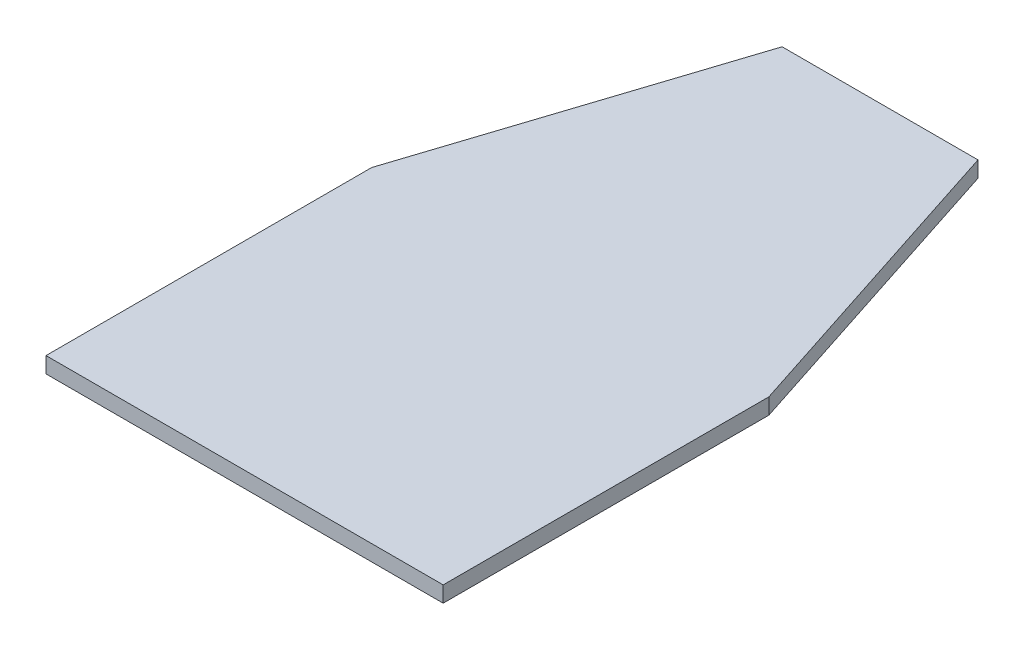
ISO-10303-21;
HEADER;
FILE_DESCRIPTION(('STEP AP214'),'2;1');
FILE_NAME('part.step','',(''),(''),'','','');
FILE_SCHEMA(('AUTOMOTIVE_DESIGN { 1 0 10303 214 1 1 1 1 }'));
ENDSEC;
DATA;
#1=APPLICATION_CONTEXT('core data for automotive mechanical design processes');
#2=APPLICATION_PROTOCOL_DEFINITION('international standard','automotive_design',2000,#1);
#3=PRODUCT_CONTEXT('',#1,'mechanical');
#4=PRODUCT('Part','Part','',(#3));
#5=PRODUCT_RELATED_PRODUCT_CATEGORY('part','',(#4));
#6=PRODUCT_DEFINITION_FORMATION('','',#4);
#7=PRODUCT_DEFINITION_CONTEXT('part definition',#1,'design');
#8=PRODUCT_DEFINITION('design','',#6,#7);
#9=PRODUCT_DEFINITION_SHAPE('','',#8);
#10=(LENGTH_UNIT() NAMED_UNIT(*) SI_UNIT(.MILLI.,.METRE.));
#11=(NAMED_UNIT(*) PLANE_ANGLE_UNIT() SI_UNIT($,.RADIAN.));
#12=(NAMED_UNIT(*) SI_UNIT($,.STERADIAN.) SOLID_ANGLE_UNIT());
#13=UNCERTAINTY_MEASURE_WITH_UNIT(LENGTH_MEASURE(1.E-05),#10,'distance_accuracy_value','');
#14=(GEOMETRIC_REPRESENTATION_CONTEXT(3) GLOBAL_UNCERTAINTY_ASSIGNED_CONTEXT((#13)) GLOBAL_UNIT_ASSIGNED_CONTEXT((#10,
#11,#12)) REPRESENTATION_CONTEXT('',''));
#15=CARTESIAN_POINT('',(0.,0.,0.));
#16=DIRECTION('',(0.,0.,1.));
#17=DIRECTION('',(1.,0.,0.));
#18=AXIS2_PLACEMENT_3D('',#15,#16,#17);
#19=CARTESIAN_POINT('',(-125.,10.,-205.017126187383));
#20=DIRECTION('',(1.,0.,0.));
#21=DIRECTION('',(0.,0.,-1.));
#22=AXIS2_PLACEMENT_3D('',#19,#20,#21);
#23=PLANE('',#22);
#24=DIRECTION('',(0.,0.,1.));
#25=VECTOR('',#24,1.);
#26=CARTESIAN_POINT('',(-125.,0.,-205.017126187383));
#27=LINE('',#26,#25);
#28=CARTESIAN_POINT('',(-125.,0.,-205.017126187383));
#29=VERTEX_POINT('',#28);
#30=CARTESIAN_POINT('',(-125.,0.,0.));
#31=VERTEX_POINT('',#30);
#32=EDGE_CURVE('E120',#29,#31,#27,.T.);
#33=ORIENTED_EDGE('',*,*,#32,.T.);
#34=DIRECTION('',(0.,-1.,0.));
#35=VECTOR('',#34,1.);
#36=CARTESIAN_POINT('',(-125.,10.,0.));
#37=LINE('',#36,#35);
#38=CARTESIAN_POINT('',(-125.,10.,0.));
#39=VERTEX_POINT('',#38);
#40=EDGE_CURVE('E11',#39,#31,#37,.T.);
#41=ORIENTED_EDGE('',*,*,#40,.F.);
#42=DIRECTION('',(0.,0.,1.));
#43=VECTOR('',#42,1.);
#44=CARTESIAN_POINT('',(-125.,10.,-205.017126187383));
#45=LINE('',#44,#43);
#46=CARTESIAN_POINT('',(-125.,10.,-205.017126187383));
#47=VERTEX_POINT('',#46);
#48=EDGE_CURVE('E130',#47,#39,#45,.T.);
#49=ORIENTED_EDGE('',*,*,#48,.F.);
#50=DIRECTION('',(0.,-1.,0.));
#51=VECTOR('',#50,1.);
#52=CARTESIAN_POINT('',(-125.,10.,-205.017126187383));
#53=LINE('',#52,#51);
#54=EDGE_CURVE('E116',#47,#29,#53,.T.);
#55=ORIENTED_EDGE('',*,*,#54,.T.);
#56=EDGE_LOOP('',(#33,#41,#49,#55));
#57=FACE_BOUND('',#56,.T.);
#58=ADVANCED_FACE('F36',(#57),#23,.F.);
#59=CARTESIAN_POINT('',(-125.,10.,0.));
#60=DIRECTION('',(0.,0.,-1.));
#61=DIRECTION('',(-1.,0.,0.));
#62=AXIS2_PLACEMENT_3D('',#59,#60,#61);
#63=PLANE('',#62);
#64=DIRECTION('',(1.,0.,0.));
#65=VECTOR('',#64,1.);
#66=CARTESIAN_POINT('',(-125.,0.,0.));
#67=LINE('',#66,#65);
#68=CARTESIAN_POINT('',(125.,0.,0.));
#69=VERTEX_POINT('',#68);
#70=EDGE_CURVE('E123',#31,#69,#67,.T.);
#71=ORIENTED_EDGE('',*,*,#70,.T.);
#72=DIRECTION('',(0.,-1.,0.));
#73=VECTOR('',#72,1.);
#74=CARTESIAN_POINT('',(125.,10.,0.));
#75=LINE('',#74,#73);
#76=CARTESIAN_POINT('',(125.,10.,0.));
#77=VERTEX_POINT('',#76);
#78=EDGE_CURVE('E44',#77,#69,#75,.T.);
#79=ORIENTED_EDGE('',*,*,#78,.F.);
#80=DIRECTION('',(1.,0.,0.));
#81=VECTOR('',#80,1.);
#82=CARTESIAN_POINT('',(-125.,10.,0.));
#83=LINE('',#82,#81);
#84=EDGE_CURVE('E89',#39,#77,#83,.T.);
#85=ORIENTED_EDGE('',*,*,#84,.F.);
#86=ORIENTED_EDGE('',*,*,#40,.T.);
#87=EDGE_LOOP('',(#71,#79,#85,#86));
#88=FACE_BOUND('',#87,.T.);
#89=ADVANCED_FACE('F154',(#88),#63,.F.);
#90=CARTESIAN_POINT('',(125.,10.,0.));
#91=DIRECTION('',(-1.,0.,0.));
#92=DIRECTION('',(0.,0.,1.));
#93=AXIS2_PLACEMENT_3D('',#90,#91,#92);
#94=PLANE('',#93);
#95=DIRECTION('',(0.,0.,-1.));
#96=VECTOR('',#95,1.);
#97=CARTESIAN_POINT('',(125.,0.,0.));
#98=LINE('',#97,#96);
#99=CARTESIAN_POINT('',(125.,0.,-205.017126187383));
#100=VERTEX_POINT('',#99);
#101=EDGE_CURVE('E125',#69,#100,#98,.T.);
#102=ORIENTED_EDGE('',*,*,#101,.T.);
#103=DIRECTION('',(0.,-1.,0.));
#104=VECTOR('',#103,1.);
#105=CARTESIAN_POINT('',(125.,10.,-205.017126187383));
#106=LINE('',#105,#104);
#107=CARTESIAN_POINT('',(125.,10.,-205.017126187383));
#108=VERTEX_POINT('',#107);
#109=EDGE_CURVE('E111',#108,#100,#106,.T.);
#110=ORIENTED_EDGE('',*,*,#109,.F.);
#111=DIRECTION('',(0.,0.,-1.));
#112=VECTOR('',#111,1.);
#113=CARTESIAN_POINT('',(125.,10.,0.));
#114=LINE('',#113,#112);
#115=EDGE_CURVE('E102',#77,#108,#114,.T.);
#116=ORIENTED_EDGE('',*,*,#115,.F.);
#117=ORIENTED_EDGE('',*,*,#78,.T.);
#118=EDGE_LOOP('',(#102,#110,#116,#117));
#119=FACE_BOUND('',#118,.T.);
#120=ADVANCED_FACE('F136',(#119),#94,.F.);
#121=CARTESIAN_POINT('',(125.,10.,-205.017126187383));
#122=DIRECTION('',(-0.951056516295152,0.,0.309016994374951));
#123=DIRECTION('',(0.309016994374951,0.,0.951056516295152));
#124=AXIS2_PLACEMENT_3D('',#121,#122,#123);
#125=PLANE('',#124);
#126=DIRECTION('',(-0.309016994374951,0.,-0.951056516295152));
#127=VECTOR('',#126,1.);
#128=CARTESIAN_POINT('',(125.,0.,-205.017126187383));
#129=LINE('',#128,#127);
#130=CARTESIAN_POINT('',(61.6462238701846,0.,-400.));
#131=VERTEX_POINT('',#130);
#132=EDGE_CURVE('E110',#100,#131,#129,.T.);
#133=ORIENTED_EDGE('',*,*,#132,.T.);
#134=DIRECTION('',(0.,-1.,0.));
#135=VECTOR('',#134,1.);
#136=CARTESIAN_POINT('',(61.6462238701846,10.,-400.));
#137=LINE('',#136,#135);
#138=CARTESIAN_POINT('',(61.6462238701846,10.,-400.));
#139=VERTEX_POINT('',#138);
#140=EDGE_CURVE('E107',#139,#131,#137,.T.);
#141=ORIENTED_EDGE('',*,*,#140,.F.);
#142=DIRECTION('',(-0.309016994374951,0.,-0.951056516295152));
#143=VECTOR('',#142,1.);
#144=CARTESIAN_POINT('',(125.,10.,-205.017126187383));
#145=LINE('',#144,#143);
#146=EDGE_CURVE('E96',#108,#139,#145,.T.);
#147=ORIENTED_EDGE('',*,*,#146,.F.);
#148=ORIENTED_EDGE('',*,*,#109,.T.);
#149=EDGE_LOOP('',(#133,#141,#147,#148));
#150=FACE_BOUND('',#149,.T.);
#151=ADVANCED_FACE('F108',(#150),#125,.F.);
#152=CARTESIAN_POINT('',(61.6462238701846,10.,-400.));
#153=DIRECTION('',(0.,0.,1.));
#154=DIRECTION('',(1.,0.,0.));
#155=AXIS2_PLACEMENT_3D('',#152,#153,#154);
#156=PLANE('',#155);
#157=DIRECTION('',(-1.,0.,0.));
#158=VECTOR('',#157,1.);
#159=CARTESIAN_POINT('',(61.6462238701846,0.,-400.));
#160=LINE('',#159,#158);
#161=CARTESIAN_POINT('',(-61.6462238701846,0.,-400.));
#162=VERTEX_POINT('',#161);
#163=EDGE_CURVE('E75',#131,#162,#160,.T.);
#164=ORIENTED_EDGE('',*,*,#163,.T.);
#165=DIRECTION('',(0.,-1.,0.));
#166=VECTOR('',#165,1.);
#167=CARTESIAN_POINT('',(-61.6462238701846,10.,-400.));
#168=LINE('',#167,#166);
#169=CARTESIAN_POINT('',(-61.6462238701846,10.,-400.));
#170=VERTEX_POINT('',#169);
#171=EDGE_CURVE('E112',#170,#162,#168,.T.);
#172=ORIENTED_EDGE('',*,*,#171,.F.);
#173=DIRECTION('',(-1.,0.,0.));
#174=VECTOR('',#173,1.);
#175=CARTESIAN_POINT('',(61.6462238701846,10.,-400.));
#176=LINE('',#175,#174);
#177=EDGE_CURVE('E100',#139,#170,#176,.T.);
#178=ORIENTED_EDGE('',*,*,#177,.F.);
#179=ORIENTED_EDGE('',*,*,#140,.T.);
#180=EDGE_LOOP('',(#164,#172,#178,#179));
#181=FACE_BOUND('',#180,.T.);
#182=ADVANCED_FACE('F114',(#181),#156,.F.);
#183=CARTESIAN_POINT('',(-61.6462238701846,10.,-400.));
#184=DIRECTION('',(0.951056516295152,0.,0.309016994374951));
#185=DIRECTION('',(0.309016994374951,0.,-0.951056516295152));
#186=AXIS2_PLACEMENT_3D('',#183,#184,#185);
#187=PLANE('',#186);
#188=DIRECTION('',(-0.309016994374951,0.,0.951056516295152));
#189=VECTOR('',#188,1.);
#190=CARTESIAN_POINT('',(-61.6462238701846,0.,-400.));
#191=LINE('',#190,#189);
#192=EDGE_CURVE('E81',#162,#29,#191,.T.);
#193=ORIENTED_EDGE('',*,*,#192,.T.);
#194=ORIENTED_EDGE('',*,*,#54,.F.);
#195=DIRECTION('',(-0.309016994374951,0.,0.951056516295152));
#196=VECTOR('',#195,1.);
#197=CARTESIAN_POINT('',(-61.6462238701846,10.,-400.));
#198=LINE('',#197,#196);
#199=EDGE_CURVE('E52',#170,#47,#198,.T.);
#200=ORIENTED_EDGE('',*,*,#199,.F.);
#201=ORIENTED_EDGE('',*,*,#171,.T.);
#202=EDGE_LOOP('',(#193,#194,#200,#201));
#203=FACE_BOUND('',#202,.T.);
#204=ADVANCED_FACE('F143',(#203),#187,.F.);
#205=CARTESIAN_POINT('',(0.,10.,0.));
#206=DIRECTION('',(0.,1.,0.));
#207=DIRECTION('',(0.,0.,1.));
#208=AXIS2_PLACEMENT_3D('',#205,#206,#207);
#209=PLANE('',#208);
#210=ORIENTED_EDGE('',*,*,#48,.T.);
#211=ORIENTED_EDGE('',*,*,#84,.T.);
#212=ORIENTED_EDGE('',*,*,#115,.T.);
#213=ORIENTED_EDGE('',*,*,#146,.T.);
#214=ORIENTED_EDGE('',*,*,#177,.T.);
#215=ORIENTED_EDGE('',*,*,#199,.T.);
#216=EDGE_LOOP('',(#210,#211,#212,#213,#214,#215));
#217=FACE_BOUND('',#216,.T.);
#218=ADVANCED_FACE('F98',(#217),#209,.T.);
#219=CARTESIAN_POINT('',(0.,0.,0.));
#220=DIRECTION('',(0.,1.,0.));
#221=DIRECTION('',(0.,0.,1.));
#222=AXIS2_PLACEMENT_3D('',#219,#220,#221);
#223=PLANE('',#222);
#224=ORIENTED_EDGE('',*,*,#32,.F.);
#225=ORIENTED_EDGE('',*,*,#192,.F.);
#226=ORIENTED_EDGE('',*,*,#163,.F.);
#227=ORIENTED_EDGE('',*,*,#132,.F.);
#228=ORIENTED_EDGE('',*,*,#101,.F.);
#229=ORIENTED_EDGE('',*,*,#70,.F.);
#230=EDGE_LOOP('',(#224,#225,#226,#227,#228,#229));
#231=FACE_BOUND('',#230,.T.);
#232=ADVANCED_FACE('F139',(#231),#223,.F.);
#233=CLOSED_SHELL('',(#58,#89,#120,#151,#182,#204,#218,#232));
#234=MANIFOLD_SOLID_BREP('B2',#233);
#235=ADVANCED_BREP_SHAPE_REPRESENTATION('',(#18,#234),#14);
#236=SHAPE_DEFINITION_REPRESENTATION(#9,#235);
ENDSEC;
END-ISO-10303-21;
